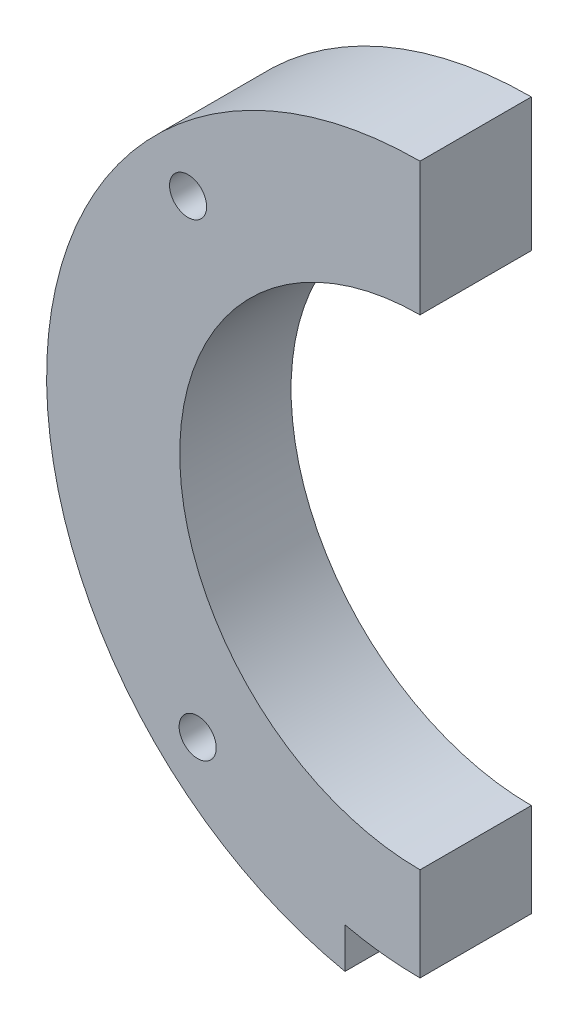
ISO-10303-21;
HEADER;
FILE_DESCRIPTION(('STEP AP214'),'2;1');
FILE_NAME('part.step','',(''),(''),'','','');
FILE_SCHEMA(('AUTOMOTIVE_DESIGN { 1 0 10303 214 1 1 1 1 }'));
ENDSEC;
DATA;
#1=APPLICATION_CONTEXT('core data for automotive mechanical design processes');
#2=APPLICATION_PROTOCOL_DEFINITION('international standard','automotive_design',2000,#1);
#3=PRODUCT_CONTEXT('',#1,'mechanical');
#4=PRODUCT('Part','Part','',(#3));
#5=PRODUCT_RELATED_PRODUCT_CATEGORY('part','',(#4));
#6=PRODUCT_DEFINITION_FORMATION('','',#4);
#7=PRODUCT_DEFINITION_CONTEXT('part definition',#1,'design');
#8=PRODUCT_DEFINITION('design','',#6,#7);
#9=PRODUCT_DEFINITION_SHAPE('','',#8);
#10=(LENGTH_UNIT() NAMED_UNIT(*) SI_UNIT(.MILLI.,.METRE.));
#11=(NAMED_UNIT(*) PLANE_ANGLE_UNIT() SI_UNIT($,.RADIAN.));
#12=(NAMED_UNIT(*) SI_UNIT($,.STERADIAN.) SOLID_ANGLE_UNIT());
#13=UNCERTAINTY_MEASURE_WITH_UNIT(LENGTH_MEASURE(1.E-05),#10,'distance_accuracy_value','');
#14=(GEOMETRIC_REPRESENTATION_CONTEXT(3) GLOBAL_UNCERTAINTY_ASSIGNED_CONTEXT((#13)) GLOBAL_UNIT_ASSIGNED_CONTEXT((#10,
#11,#12)) REPRESENTATION_CONTEXT('',''));
#15=CARTESIAN_POINT('',(0.,0.,0.));
#16=DIRECTION('',(0.,0.,1.));
#17=DIRECTION('',(1.,0.,0.));
#18=AXIS2_PLACEMENT_3D('',#15,#16,#17);
#19=CARTESIAN_POINT('',(35.0862822428805,50.0800803803024,12.));
#20=DIRECTION('',(0.,0.,-1.));
#21=DIRECTION('',(-1.,0.,0.));
#22=AXIS2_PLACEMENT_3D('',#19,#20,#21);
#23=CYLINDRICAL_SURFACE('',#22,36.);
#24=CARTESIAN_POINT('',(35.0862822428805,50.0800803803024,0.));
#25=DIRECTION('',(0.,0.,1.));
#26=DIRECTION('',(1.,0.,0.));
#27=AXIS2_PLACEMENT_3D('',#24,#25,#26);
#28=CIRCLE('',#27,36.);
#29=CARTESIAN_POINT('',(27.,15.,0.));
#30=VERTEX_POINT('',#29);
#31=CARTESIAN_POINT('',(35.0862822428805,14.0800803803024,0.));
#32=VERTEX_POINT('',#31);
#33=EDGE_CURVE('E121',#30,#32,#28,.T.);
#34=ORIENTED_EDGE('',*,*,#33,.T.);
#35=DIRECTION('',(0.,0.,-1.));
#36=VECTOR('',#35,1.);
#37=CARTESIAN_POINT('',(35.0862822428805,14.0800803803024,12.));
#38=LINE('',#37,#36);
#39=CARTESIAN_POINT('',(35.0862822428805,14.0800803803024,12.));
#40=VERTEX_POINT('',#39);
#41=EDGE_CURVE('E11',#40,#32,#38,.T.);
#42=ORIENTED_EDGE('',*,*,#41,.F.);
#43=CARTESIAN_POINT('',(35.0862822428805,50.0800803803024,12.));
#44=DIRECTION('',(0.,0.,1.));
#45=DIRECTION('',(1.,0.,0.));
#46=AXIS2_PLACEMENT_3D('',#43,#44,#45);
#47=CIRCLE('',#46,36.);
#48=CARTESIAN_POINT('',(27.,15.,12.));
#49=VERTEX_POINT('',#48);
#50=EDGE_CURVE('E132',#49,#40,#47,.T.);
#51=ORIENTED_EDGE('',*,*,#50,.F.);
#52=DIRECTION('',(0.,0.,-1.));
#53=VECTOR('',#52,1.);
#54=CARTESIAN_POINT('',(27.,15.,12.));
#55=LINE('',#54,#53);
#56=EDGE_CURVE('E117',#49,#30,#55,.T.);
#57=ORIENTED_EDGE('',*,*,#56,.T.);
#58=EDGE_LOOP('',(#34,#42,#51,#57));
#59=FACE_BOUND('',#58,.T.);
#60=ADVANCED_FACE('F35',(#59),#23,.T.);
#61=CARTESIAN_POINT('',(35.0862822428805,24.1800803803024,12.));
#62=DIRECTION('',(-1.,0.,0.));
#63=DIRECTION('',(0.,-1.,0.));
#64=AXIS2_PLACEMENT_3D('',#61,#62,#63);
#65=PLANE('',#64);
#66=DIRECTION('',(0.,1.,0.));
#67=VECTOR('',#66,1.);
#68=CARTESIAN_POINT('',(35.0862822428805,24.1800803803024,0.));
#69=LINE('',#68,#67);
#70=CARTESIAN_POINT('',(35.0862822428805,24.1800803803024,0.));
#71=VERTEX_POINT('',#70);
#72=EDGE_CURVE('E124',#32,#71,#69,.T.);
#73=ORIENTED_EDGE('',*,*,#72,.T.);
#74=DIRECTION('',(0.,0.,-1.));
#75=VECTOR('',#74,1.);
#76=CARTESIAN_POINT('',(35.0862822428805,24.1800803803024,12.));
#77=LINE('',#76,#75);
#78=CARTESIAN_POINT('',(35.0862822428805,24.1800803803024,12.));
#79=VERTEX_POINT('',#78);
#80=EDGE_CURVE('E44',#79,#71,#77,.T.);
#81=ORIENTED_EDGE('',*,*,#80,.F.);
#82=DIRECTION('',(0.,1.,0.));
#83=VECTOR('',#82,1.);
#84=CARTESIAN_POINT('',(35.0862822428805,24.1800803803024,12.));
#85=LINE('',#84,#83);
#86=EDGE_CURVE('E90',#40,#79,#85,.T.);
#87=ORIENTED_EDGE('',*,*,#86,.F.);
#88=ORIENTED_EDGE('',*,*,#41,.T.);
#89=EDGE_LOOP('',(#73,#81,#87,#88));
#90=FACE_BOUND('',#89,.T.);
#91=ADVANCED_FACE('F152',(#90),#65,.F.);
#92=CARTESIAN_POINT('',(35.0862822428805,50.0800803803024,12.));
#93=DIRECTION('',(0.,0.,-1.));
#94=DIRECTION('',(-1.,0.,0.));
#95=AXIS2_PLACEMENT_3D('',#92,#93,#94);
#96=CYLINDRICAL_SURFACE('',#95,25.9);
#97=CARTESIAN_POINT('',(35.0862822428805,50.0800803803024,0.));
#98=DIRECTION('',(0.,0.,-1.));
#99=DIRECTION('',(1.,0.,0.));
#100=AXIS2_PLACEMENT_3D('',#97,#98,#99);
#101=CIRCLE('',#100,25.9);
#102=CARTESIAN_POINT('',(35.0862822428805,75.9800803803024,0.));
#103=VERTEX_POINT('',#102);
#104=EDGE_CURVE('E127',#71,#103,#101,.T.);
#105=ORIENTED_EDGE('',*,*,#104,.T.);
#106=DIRECTION('',(0.,0.,-1.));
#107=VECTOR('',#106,1.);
#108=CARTESIAN_POINT('',(35.0862822428805,75.9800803803024,12.));
#109=LINE('',#108,#107);
#110=CARTESIAN_POINT('',(35.0862822428805,75.9800803803024,12.));
#111=VERTEX_POINT('',#110);
#112=EDGE_CURVE('E112',#111,#103,#109,.T.);
#113=ORIENTED_EDGE('',*,*,#112,.F.);
#114=CARTESIAN_POINT('',(35.0862822428805,50.0800803803024,12.));
#115=DIRECTION('',(0.,0.,-1.));
#116=DIRECTION('',(1.,0.,0.));
#117=AXIS2_PLACEMENT_3D('',#114,#115,#116);
#118=CIRCLE('',#117,25.9);
#119=EDGE_CURVE('E103',#79,#111,#118,.T.);
#120=ORIENTED_EDGE('',*,*,#119,.F.);
#121=ORIENTED_EDGE('',*,*,#80,.T.);
#122=EDGE_LOOP('',(#105,#113,#120,#121));
#123=FACE_BOUND('',#122,.T.);
#124=ADVANCED_FACE('F155',(#123),#96,.F.);
#125=CARTESIAN_POINT('',(35.0862822428805,90.33232928245,12.));
#126=DIRECTION('',(-1.,0.,0.));
#127=DIRECTION('',(0.,-1.,0.));
#128=AXIS2_PLACEMENT_3D('',#125,#126,#127);
#129=PLANE('',#128);
#130=DIRECTION('',(0.,1.,0.));
#131=VECTOR('',#130,1.);
#132=CARTESIAN_POINT('',(35.0862822428805,90.33232928245,0.));
#133=LINE('',#132,#131);
#134=CARTESIAN_POINT('',(35.0862822428805,90.33232928245,0.));
#135=VERTEX_POINT('',#134);
#136=EDGE_CURVE('E111',#103,#135,#133,.T.);
#137=ORIENTED_EDGE('',*,*,#136,.T.);
#138=DIRECTION('',(0.,0.,-1.));
#139=VECTOR('',#138,1.);
#140=CARTESIAN_POINT('',(35.0862822428805,90.33232928245,12.));
#141=LINE('',#140,#139);
#142=CARTESIAN_POINT('',(35.0862822428805,90.33232928245,12.));
#143=VERTEX_POINT('',#142);
#144=EDGE_CURVE('E108',#143,#135,#141,.T.);
#145=ORIENTED_EDGE('',*,*,#144,.F.);
#146=DIRECTION('',(0.,1.,0.));
#147=VECTOR('',#146,1.);
#148=CARTESIAN_POINT('',(35.0862822428805,90.33232928245,12.));
#149=LINE('',#148,#147);
#150=EDGE_CURVE('E97',#111,#143,#149,.T.);
#151=ORIENTED_EDGE('',*,*,#150,.F.);
#152=ORIENTED_EDGE('',*,*,#112,.T.);
#153=EDGE_LOOP('',(#137,#145,#151,#152));
#154=FACE_BOUND('',#153,.T.);
#155=ADVANCED_FACE('F109',(#154),#129,.F.);
#156=CARTESIAN_POINT('',(35.0862822428805,50.0800803803024,12.));
#157=DIRECTION('',(0.,0.,-1.));
#158=DIRECTION('',(-1.,0.,0.));
#159=AXIS2_PLACEMENT_3D('',#156,#157,#158);
#160=CYLINDRICAL_SURFACE('',#159,40.2522489021477);
#161=CARTESIAN_POINT('',(35.0862822428805,50.0800803803024,0.));
#162=DIRECTION('',(0.,0.,1.));
#163=DIRECTION('',(1.,0.,0.));
#164=AXIS2_PLACEMENT_3D('',#161,#162,#163);
#165=CIRCLE('',#164,40.2522489021477);
#166=CARTESIAN_POINT('',(27.,10.6484232864276,0.));
#167=VERTEX_POINT('',#166);
#168=EDGE_CURVE('E76',#135,#167,#165,.T.);
#169=ORIENTED_EDGE('',*,*,#168,.T.);
#170=DIRECTION('',(0.,0.,-1.));
#171=VECTOR('',#170,1.);
#172=CARTESIAN_POINT('',(27.,10.6484232864276,12.));
#173=LINE('',#172,#171);
#174=CARTESIAN_POINT('',(27.,10.6484232864276,12.));
#175=VERTEX_POINT('',#174);
#176=EDGE_CURVE('E113',#175,#167,#173,.T.);
#177=ORIENTED_EDGE('',*,*,#176,.F.);
#178=CARTESIAN_POINT('',(35.0862822428805,50.0800803803024,12.));
#179=DIRECTION('',(0.,0.,1.));
#180=DIRECTION('',(1.,0.,0.));
#181=AXIS2_PLACEMENT_3D('',#178,#179,#180);
#182=CIRCLE('',#181,40.2522489021477);
#183=EDGE_CURVE('E101',#143,#175,#182,.T.);
#184=ORIENTED_EDGE('',*,*,#183,.F.);
#185=ORIENTED_EDGE('',*,*,#144,.T.);
#186=EDGE_LOOP('',(#169,#177,#184,#185));
#187=FACE_BOUND('',#186,.T.);
#188=ADVANCED_FACE('F115',(#187),#160,.T.);
#189=CARTESIAN_POINT('',(27.,10.6484232864276,12.));
#190=DIRECTION('',(-1.,0.,0.));
#191=DIRECTION('',(0.,0.,1.));
#192=AXIS2_PLACEMENT_3D('',#189,#190,#191);
#193=PLANE('',#192);
#194=DIRECTION('',(0.,1.,0.));
#195=VECTOR('',#194,1.);
#196=CARTESIAN_POINT('',(27.,10.6484232864276,0.));
#197=LINE('',#196,#195);
#198=EDGE_CURVE('E82',#167,#30,#197,.T.);
#199=ORIENTED_EDGE('',*,*,#198,.T.);
#200=ORIENTED_EDGE('',*,*,#56,.F.);
#201=DIRECTION('',(0.,1.,0.));
#202=VECTOR('',#201,1.);
#203=CARTESIAN_POINT('',(27.,10.6484232864276,12.));
#204=LINE('',#203,#202);
#205=EDGE_CURVE('E53',#175,#49,#204,.T.);
#206=ORIENTED_EDGE('',*,*,#205,.F.);
#207=ORIENTED_EDGE('',*,*,#176,.T.);
#208=EDGE_LOOP('',(#199,#200,#206,#207));
#209=FACE_BOUND('',#208,.T.);
#210=ADVANCED_FACE('F160',(#209),#193,.F.);
#211=CARTESIAN_POINT('',(35.0862822428805,50.0800803803024,12.));
#212=DIRECTION('',(0.,0.,1.));
#213=DIRECTION('',(1.,0.,0.));
#214=AXIS2_PLACEMENT_3D('',#211,#212,#213);
#215=PLANE('',#214);
#216=CARTESIAN_POINT('',(11.1177665862284,24.5749778081342,12.));
#217=DIRECTION('',(0.,0.,1.));
#218=DIRECTION('',(1.,0.,0.));
#219=AXIS2_PLACEMENT_3D('',#216,#217,#218);
#220=CIRCLE('',#219,2.);
#221=CARTESIAN_POINT('',(13.1177665862284,24.5749778081342,12.));
#222=VERTEX_POINT('',#221);
#223=EDGE_CURVE('E146',#222,#222,#220,.T.);
#224=ORIENTED_EDGE('',*,*,#223,.F.);
#225=EDGE_LOOP('',(#224));
#226=FACE_BOUND('',#225,.T.);
#227=CARTESIAN_POINT('',(10.0862822428805,74.5749778081342,12.));
#228=DIRECTION('',(0.,0.,1.));
#229=DIRECTION('',(1.,0.,0.));
#230=AXIS2_PLACEMENT_3D('',#227,#228,#229);
#231=CIRCLE('',#230,2.);
#232=CARTESIAN_POINT('',(12.0862822428805,74.5749778081342,12.));
#233=VERTEX_POINT('',#232);
#234=EDGE_CURVE('E138',#233,#233,#231,.T.);
#235=ORIENTED_EDGE('',*,*,#234,.F.);
#236=EDGE_LOOP('',(#235));
#237=FACE_BOUND('',#236,.T.);
#238=ORIENTED_EDGE('',*,*,#50,.T.);
#239=ORIENTED_EDGE('',*,*,#86,.T.);
#240=ORIENTED_EDGE('',*,*,#119,.T.);
#241=ORIENTED_EDGE('',*,*,#150,.T.);
#242=ORIENTED_EDGE('',*,*,#183,.T.);
#243=ORIENTED_EDGE('',*,*,#205,.T.);
#244=EDGE_LOOP('',(#238,#239,#240,#241,#242,#243));
#245=FACE_BOUND('',#244,.T.);
#246=ADVANCED_FACE('F99',(#226,#237,#245),#215,.T.);
#247=CARTESIAN_POINT('',(35.0862822428805,50.0800803803024,0.));
#248=DIRECTION('',(0.,0.,1.));
#249=DIRECTION('',(1.,0.,0.));
#250=AXIS2_PLACEMENT_3D('',#247,#248,#249);
#251=PLANE('',#250);
#252=CARTESIAN_POINT('',(11.1177665862284,24.5749778081342,0.));
#253=DIRECTION('',(0.,0.,1.));
#254=DIRECTION('',(1.,0.,0.));
#255=AXIS2_PLACEMENT_3D('',#252,#253,#254);
#256=CIRCLE('',#255,2.);
#257=CARTESIAN_POINT('',(13.1177665862284,24.5749778081342,0.));
#258=VERTEX_POINT('',#257);
#259=EDGE_CURVE('E38',#258,#258,#256,.T.);
#260=ORIENTED_EDGE('',*,*,#259,.T.);
#261=EDGE_LOOP('',(#260));
#262=FACE_BOUND('',#261,.T.);
#263=CARTESIAN_POINT('',(10.0862822428805,74.5749778081342,0.));
#264=DIRECTION('',(0.,0.,1.));
#265=DIRECTION('',(1.,0.,0.));
#266=AXIS2_PLACEMENT_3D('',#263,#264,#265);
#267=CIRCLE('',#266,2.);
#268=CARTESIAN_POINT('',(12.0862822428805,74.5749778081342,0.));
#269=VERTEX_POINT('',#268);
#270=EDGE_CURVE('E125',#269,#269,#267,.T.);
#271=ORIENTED_EDGE('',*,*,#270,.T.);
#272=EDGE_LOOP('',(#271));
#273=FACE_BOUND('',#272,.T.);
#274=ORIENTED_EDGE('',*,*,#33,.F.);
#275=ORIENTED_EDGE('',*,*,#198,.F.);
#276=ORIENTED_EDGE('',*,*,#168,.F.);
#277=ORIENTED_EDGE('',*,*,#136,.F.);
#278=ORIENTED_EDGE('',*,*,#104,.F.);
#279=ORIENTED_EDGE('',*,*,#72,.F.);
#280=EDGE_LOOP('',(#274,#275,#276,#277,#278,#279));
#281=FACE_BOUND('',#280,.T.);
#282=ADVANCED_FACE('F158',(#262,#273,#281),#251,.F.);
#283=CARTESIAN_POINT('',(10.0862822428805,74.5749778081342,-8.));
#284=DIRECTION('',(0.,0.,1.));
#285=DIRECTION('',(1.,0.,0.));
#286=AXIS2_PLACEMENT_3D('',#283,#284,#285);
#287=CYLINDRICAL_SURFACE('',#286,2.);
#288=ORIENTED_EDGE('',*,*,#234,.T.);
#289=EDGE_LOOP('',(#288));
#290=FACE_BOUND('',#289,.T.);
#291=ORIENTED_EDGE('',*,*,#270,.F.);
#292=EDGE_LOOP('',(#291));
#293=FACE_BOUND('',#292,.T.);
#294=ADVANCED_FACE('F208',(#290,#293),#287,.F.);
#295=CARTESIAN_POINT('',(11.1177665862284,24.5749778081342,-8.));
#296=DIRECTION('',(0.,0.,1.));
#297=DIRECTION('',(1.,0.,0.));
#298=AXIS2_PLACEMENT_3D('',#295,#296,#297);
#299=CYLINDRICAL_SURFACE('',#298,2.);
#300=ORIENTED_EDGE('',*,*,#223,.T.);
#301=EDGE_LOOP('',(#300));
#302=FACE_BOUND('',#301,.T.);
#303=ORIENTED_EDGE('',*,*,#259,.F.);
#304=EDGE_LOOP('',(#303));
#305=FACE_BOUND('',#304,.T.);
#306=ADVANCED_FACE('F217',(#302,#305),#299,.F.);
#307=CLOSED_SHELL('',(#60,#91,#124,#155,#188,#210,#246,#282,#294,#306));
#308=MANIFOLD_SOLID_BREP('B2',#307);
#309=ADVANCED_BREP_SHAPE_REPRESENTATION('',(#18,#308),#14);
#310=SHAPE_DEFINITION_REPRESENTATION(#9,#309);
ENDSEC;
END-ISO-10303-21;
